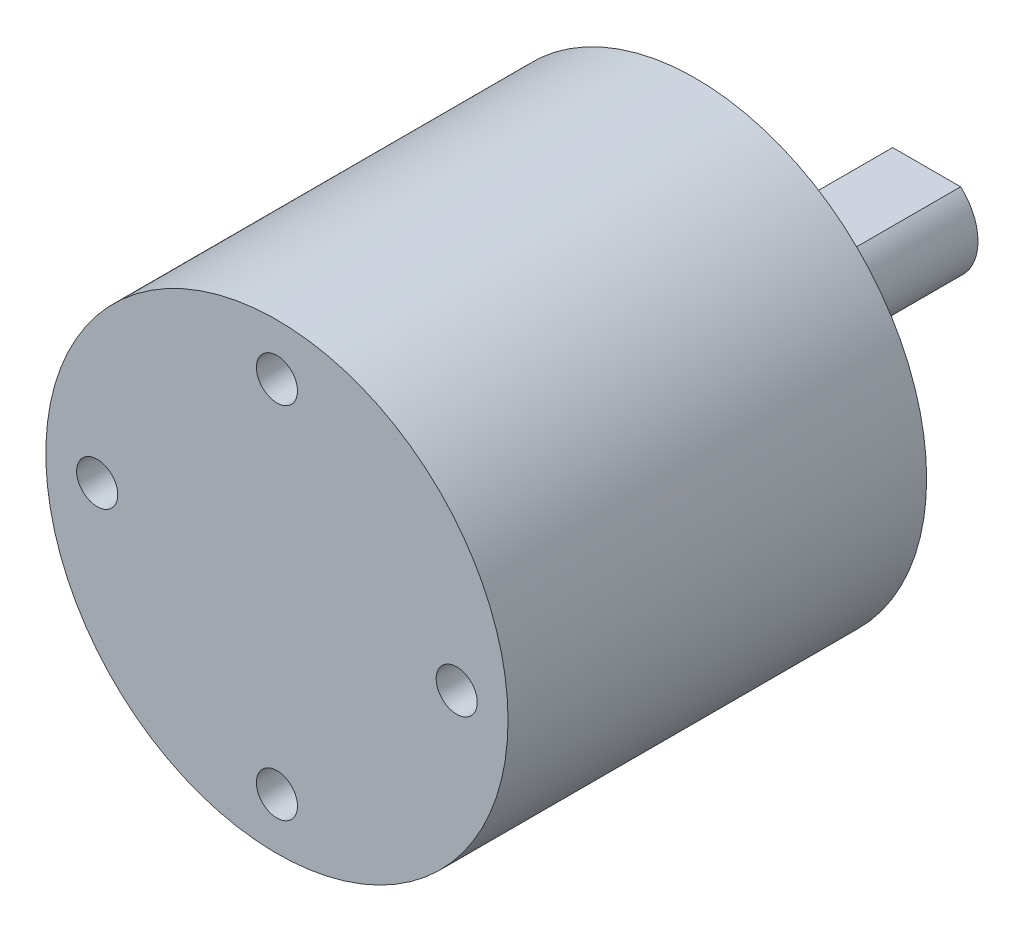
ISO-10303-21;
HEADER;
FILE_DESCRIPTION(('STEP AP214'),'2;1');
FILE_NAME('part.step','',(''),(''),'','','');
FILE_SCHEMA(('AUTOMOTIVE_DESIGN { 1 0 10303 214 1 1 1 1 }'));
ENDSEC;
DATA;
#1=APPLICATION_CONTEXT('core data for automotive mechanical design processes');
#2=APPLICATION_PROTOCOL_DEFINITION('international standard','automotive_design',2000,#1);
#3=PRODUCT_CONTEXT('',#1,'mechanical');
#4=PRODUCT('Part','Part','',(#3));
#5=PRODUCT_RELATED_PRODUCT_CATEGORY('part','',(#4));
#6=PRODUCT_DEFINITION_FORMATION('','',#4);
#7=PRODUCT_DEFINITION_CONTEXT('part definition',#1,'design');
#8=PRODUCT_DEFINITION('design','',#6,#7);
#9=PRODUCT_DEFINITION_SHAPE('','',#8);
#10=(LENGTH_UNIT() NAMED_UNIT(*) SI_UNIT(.MILLI.,.METRE.));
#11=(NAMED_UNIT(*) PLANE_ANGLE_UNIT() SI_UNIT($,.RADIAN.));
#12=(NAMED_UNIT(*) SI_UNIT($,.STERADIAN.) SOLID_ANGLE_UNIT());
#13=UNCERTAINTY_MEASURE_WITH_UNIT(LENGTH_MEASURE(1.E-05),#10,'distance_accuracy_value','');
#14=(GEOMETRIC_REPRESENTATION_CONTEXT(3) GLOBAL_UNCERTAINTY_ASSIGNED_CONTEXT((#13)) GLOBAL_UNIT_ASSIGNED_CONTEXT((#10,
#11,#12)) REPRESENTATION_CONTEXT('',''));
#15=CARTESIAN_POINT('',(0.,0.,0.));
#16=DIRECTION('',(0.,0.,1.));
#17=DIRECTION('',(1.,0.,0.));
#18=AXIS2_PLACEMENT_3D('',#15,#16,#17);
#19=CARTESIAN_POINT('',(0.,0.,32.6));
#20=DIRECTION('',(0.,0.,-1.));
#21=DIRECTION('',(-1.,0.,0.));
#22=AXIS2_PLACEMENT_3D('',#19,#20,#21);
#23=CYLINDRICAL_SURFACE('',#22,18.);
#24=CARTESIAN_POINT('',(0.,0.,32.6));
#25=DIRECTION('',(0.,0.,1.));
#26=DIRECTION('',(1.,0.,0.));
#27=AXIS2_PLACEMENT_3D('',#24,#25,#26);
#28=CIRCLE('',#27,18.);
#29=CARTESIAN_POINT('',(18.,0.,32.6));
#30=VERTEX_POINT('',#29);
#31=EDGE_CURVE('E168',#30,#30,#28,.T.);
#32=ORIENTED_EDGE('',*,*,#31,.F.);
#33=EDGE_LOOP('',(#32));
#34=FACE_BOUND('',#33,.T.);
#35=CARTESIAN_POINT('',(0.,0.,0.));
#36=DIRECTION('',(0.,0.,1.));
#37=DIRECTION('',(1.,0.,0.));
#38=AXIS2_PLACEMENT_3D('',#35,#36,#37);
#39=CIRCLE('',#38,18.);
#40=CARTESIAN_POINT('',(18.,0.,0.));
#41=VERTEX_POINT('',#40);
#42=EDGE_CURVE('E164',#41,#41,#39,.T.);
#43=ORIENTED_EDGE('',*,*,#42,.T.);
#44=EDGE_LOOP('',(#43));
#45=FACE_BOUND('',#44,.T.);
#46=ADVANCED_FACE('F45',(#34,#45),#23,.T.);
#47=CARTESIAN_POINT('',(0.,0.,32.6));
#48=DIRECTION('',(0.,0.,1.));
#49=DIRECTION('',(1.,0.,0.));
#50=AXIS2_PLACEMENT_3D('',#47,#48,#49);
#51=PLANE('',#50);
#52=CARTESIAN_POINT('',(-14.,0.,32.6));
#53=DIRECTION('',(0.,0.,-1.));
#54=DIRECTION('',(0.,-1.,0.));
#55=AXIS2_PLACEMENT_3D('',#52,#53,#54);
#56=CIRCLE('',#55,1.6);
#57=CARTESIAN_POINT('',(-14.,-1.60000000000005,32.6));
#58=VERTEX_POINT('',#57);
#59=EDGE_CURVE('E136',#58,#58,#56,.T.);
#60=ORIENTED_EDGE('',*,*,#59,.T.);
#61=EDGE_LOOP('',(#60));
#62=FACE_BOUND('',#61,.T.);
#63=CARTESIAN_POINT('',(0.,-14.,32.6));
#64=DIRECTION('',(0.,0.,-1.));
#65=DIRECTION('',(1.,0.,0.));
#66=AXIS2_PLACEMENT_3D('',#63,#64,#65);
#67=CIRCLE('',#66,1.6);
#68=CARTESIAN_POINT('',(1.6,-14.,32.6));
#69=VERTEX_POINT('',#68);
#70=EDGE_CURVE('E145',#69,#69,#67,.T.);
#71=ORIENTED_EDGE('',*,*,#70,.T.);
#72=EDGE_LOOP('',(#71));
#73=FACE_BOUND('',#72,.T.);
#74=CARTESIAN_POINT('',(14.,1.46642216231412E-13,32.6));
#75=DIRECTION('',(0.,0.,-1.));
#76=DIRECTION('',(0.,1.,0.));
#77=AXIS2_PLACEMENT_3D('',#74,#75,#76);
#78=CIRCLE('',#77,1.6);
#79=CARTESIAN_POINT('',(14.,1.60000000000015,32.6));
#80=VERTEX_POINT('',#79);
#81=EDGE_CURVE('E153',#80,#80,#78,.T.);
#82=ORIENTED_EDGE('',*,*,#81,.T.);
#83=EDGE_LOOP('',(#82));
#84=FACE_BOUND('',#83,.T.);
#85=CARTESIAN_POINT('',(0.,14.,32.6));
#86=DIRECTION('',(0.,0.,-1.));
#87=DIRECTION('',(-1.,0.,0.));
#88=AXIS2_PLACEMENT_3D('',#85,#86,#87);
#89=CIRCLE('',#88,1.6);
#90=CARTESIAN_POINT('',(-1.6,14.,32.6));
#91=VERTEX_POINT('',#90);
#92=EDGE_CURVE('E160',#91,#91,#89,.T.);
#93=ORIENTED_EDGE('',*,*,#92,.T.);
#94=EDGE_LOOP('',(#93));
#95=FACE_BOUND('',#94,.T.);
#96=ORIENTED_EDGE('',*,*,#31,.T.);
#97=EDGE_LOOP('',(#96));
#98=FACE_BOUND('',#97,.T.);
#99=ADVANCED_FACE('F179',(#62,#73,#84,#95,#98),#51,.T.);
#100=CARTESIAN_POINT('',(0.,0.,0.));
#101=DIRECTION('',(0.,0.,1.));
#102=DIRECTION('',(1.,0.,0.));
#103=AXIS2_PLACEMENT_3D('',#100,#101,#102);
#104=PLANE('',#103);
#105=CARTESIAN_POINT('',(0.,0.,0.));
#106=DIRECTION('',(0.,0.,1.));
#107=DIRECTION('',(1.,0.,0.));
#108=AXIS2_PLACEMENT_3D('',#105,#106,#107);
#109=CIRCLE('',#108,11.);
#110=CARTESIAN_POINT('',(11.,0.,0.));
#111=VERTEX_POINT('',#110);
#112=EDGE_CURVE('E48',#111,#111,#109,.F.);
#113=ORIENTED_EDGE('',*,*,#112,.F.);
#114=EDGE_LOOP('',(#113));
#115=FACE_BOUND('',#114,.T.);
#116=CARTESIAN_POINT('',(-14.,0.,0.));
#117=DIRECTION('',(0.,0.,-1.));
#118=DIRECTION('',(0.,-1.,0.));
#119=AXIS2_PLACEMENT_3D('',#116,#117,#118);
#120=CIRCLE('',#119,1.6);
#121=CARTESIAN_POINT('',(-14.,-1.60000000000005,0.));
#122=VERTEX_POINT('',#121);
#123=EDGE_CURVE('E141',#122,#122,#120,.T.);
#124=ORIENTED_EDGE('',*,*,#123,.F.);
#125=EDGE_LOOP('',(#124));
#126=FACE_BOUND('',#125,.T.);
#127=CARTESIAN_POINT('',(0.,-14.,0.));
#128=DIRECTION('',(0.,0.,-1.));
#129=DIRECTION('',(1.,0.,0.));
#130=AXIS2_PLACEMENT_3D('',#127,#128,#129);
#131=CIRCLE('',#130,1.6);
#132=CARTESIAN_POINT('',(1.6,-14.,0.));
#133=VERTEX_POINT('',#132);
#134=EDGE_CURVE('E149',#133,#133,#131,.T.);
#135=ORIENTED_EDGE('',*,*,#134,.F.);
#136=EDGE_LOOP('',(#135));
#137=FACE_BOUND('',#136,.T.);
#138=CARTESIAN_POINT('',(14.,1.46642216231412E-13,0.));
#139=DIRECTION('',(0.,0.,-1.));
#140=DIRECTION('',(0.,1.,0.));
#141=AXIS2_PLACEMENT_3D('',#138,#139,#140);
#142=CIRCLE('',#141,1.6);
#143=CARTESIAN_POINT('',(14.,1.60000000000015,0.));
#144=VERTEX_POINT('',#143);
#145=EDGE_CURVE('E135',#144,#144,#142,.T.);
#146=ORIENTED_EDGE('',*,*,#145,.F.);
#147=EDGE_LOOP('',(#146));
#148=FACE_BOUND('',#147,.T.);
#149=CARTESIAN_POINT('',(0.,14.,0.));
#150=DIRECTION('',(0.,0.,-1.));
#151=DIRECTION('',(-1.,0.,0.));
#152=AXIS2_PLACEMENT_3D('',#149,#150,#151);
#153=CIRCLE('',#152,1.6);
#154=CARTESIAN_POINT('',(-1.6,14.,0.));
#155=VERTEX_POINT('',#154);
#156=EDGE_CURVE('E140',#155,#155,#153,.T.);
#157=ORIENTED_EDGE('',*,*,#156,.F.);
#158=EDGE_LOOP('',(#157));
#159=FACE_BOUND('',#158,.T.);
#160=ORIENTED_EDGE('',*,*,#42,.F.);
#161=EDGE_LOOP('',(#160));
#162=FACE_BOUND('',#161,.T.);
#163=ADVANCED_FACE('F176',(#115,#126,#137,#148,#159,#162),#104,.F.);
#164=CARTESIAN_POINT('',(0.,14.,32.6));
#165=DIRECTION('',(0.,0.,-1.));
#166=DIRECTION('',(-1.,0.,0.));
#167=AXIS2_PLACEMENT_3D('',#164,#165,#166);
#168=CYLINDRICAL_SURFACE('',#167,1.6);
#169=ORIENTED_EDGE('',*,*,#92,.F.);
#170=EDGE_LOOP('',(#169));
#171=FACE_BOUND('',#170,.T.);
#172=ORIENTED_EDGE('',*,*,#156,.T.);
#173=EDGE_LOOP('',(#172));
#174=FACE_BOUND('',#173,.T.);
#175=ADVANCED_FACE('F178',(#171,#174),#168,.F.);
#176=CARTESIAN_POINT('',(14.,1.46642216231412E-13,32.6));
#177=DIRECTION('',(0.,0.,-1.));
#178=DIRECTION('',(-1.,0.,0.));
#179=AXIS2_PLACEMENT_3D('',#176,#177,#178);
#180=CYLINDRICAL_SURFACE('',#179,1.6);
#181=ORIENTED_EDGE('',*,*,#81,.F.);
#182=EDGE_LOOP('',(#181));
#183=FACE_BOUND('',#182,.T.);
#184=ORIENTED_EDGE('',*,*,#145,.T.);
#185=EDGE_LOOP('',(#184));
#186=FACE_BOUND('',#185,.T.);
#187=ADVANCED_FACE('F186',(#183,#186),#180,.F.);
#188=CARTESIAN_POINT('',(0.,-14.,32.6));
#189=DIRECTION('',(0.,0.,-1.));
#190=DIRECTION('',(-1.,0.,0.));
#191=AXIS2_PLACEMENT_3D('',#188,#189,#190);
#192=CYLINDRICAL_SURFACE('',#191,1.6);
#193=ORIENTED_EDGE('',*,*,#70,.F.);
#194=EDGE_LOOP('',(#193));
#195=FACE_BOUND('',#194,.T.);
#196=ORIENTED_EDGE('',*,*,#134,.T.);
#197=EDGE_LOOP('',(#196));
#198=FACE_BOUND('',#197,.T.);
#199=ADVANCED_FACE('F217',(#195,#198),#192,.F.);
#200=CARTESIAN_POINT('',(-14.,0.,32.6));
#201=DIRECTION('',(0.,0.,-1.));
#202=DIRECTION('',(-1.,0.,0.));
#203=AXIS2_PLACEMENT_3D('',#200,#201,#202);
#204=CYLINDRICAL_SURFACE('',#203,1.6);
#205=ORIENTED_EDGE('',*,*,#59,.F.);
#206=EDGE_LOOP('',(#205));
#207=FACE_BOUND('',#206,.T.);
#208=ORIENTED_EDGE('',*,*,#123,.T.);
#209=EDGE_LOOP('',(#208));
#210=FACE_BOUND('',#209,.T.);
#211=ADVANCED_FACE('F225',(#207,#210),#204,.F.);
#212=CARTESIAN_POINT('',(0.,0.,-2.));
#213=DIRECTION('',(0.,0.,1.));
#214=DIRECTION('',(1.,0.,0.));
#215=AXIS2_PLACEMENT_3D('',#212,#213,#214);
#216=CYLINDRICAL_SURFACE('',#215,11.);
#217=CARTESIAN_POINT('',(0.,0.,-2.));
#218=DIRECTION('',(0.,0.,-1.));
#219=DIRECTION('',(-1.,0.,0.));
#220=AXIS2_PLACEMENT_3D('',#217,#218,#219);
#221=CIRCLE('',#220,11.);
#222=CARTESIAN_POINT('',(-11.,0.,-2.));
#223=VERTEX_POINT('',#222);
#224=EDGE_CURVE('E131',#223,#223,#221,.T.);
#225=ORIENTED_EDGE('',*,*,#224,.F.);
#226=EDGE_LOOP('',(#225));
#227=FACE_BOUND('',#226,.T.);
#228=ORIENTED_EDGE('',*,*,#112,.T.);
#229=EDGE_LOOP('',(#228));
#230=FACE_BOUND('',#229,.T.);
#231=ADVANCED_FACE('F233',(#227,#230),#216,.T.);
#232=CARTESIAN_POINT('',(0.,0.,-2.));
#233=DIRECTION('',(0.,0.,-1.));
#234=DIRECTION('',(-1.,0.,0.));
#235=AXIS2_PLACEMENT_3D('',#232,#233,#234);
#236=PLANE('',#235);
#237=CARTESIAN_POINT('',(0.,0.,-2.));
#238=DIRECTION('',(0.,0.,-1.));
#239=DIRECTION('',(-1.,0.,0.));
#240=AXIS2_PLACEMENT_3D('',#237,#238,#239);
#241=CIRCLE('',#240,4.);
#242=CARTESIAN_POINT('',(-4.,0.,-2.));
#243=VERTEX_POINT('',#242);
#244=EDGE_CURVE('E11',#243,#243,#241,.T.);
#245=ORIENTED_EDGE('',*,*,#244,.F.);
#246=EDGE_LOOP('',(#245));
#247=FACE_BOUND('',#246,.T.);
#248=ORIENTED_EDGE('',*,*,#224,.T.);
#249=EDGE_LOOP('',(#248));
#250=FACE_BOUND('',#249,.T.);
#251=ADVANCED_FACE('F245',(#247,#250),#236,.T.);
#252=CARTESIAN_POINT('',(0.,0.,-18.));
#253=DIRECTION('',(0.,0.,1.));
#254=DIRECTION('',(1.,0.,0.));
#255=AXIS2_PLACEMENT_3D('',#252,#253,#254);
#256=CYLINDRICAL_SURFACE('',#255,4.);
#257=CARTESIAN_POINT('',(0.,0.,-18.));
#258=DIRECTION('',(0.,0.,-1.));
#259=DIRECTION('',(-1.,0.,0.));
#260=AXIS2_PLACEMENT_3D('',#257,#258,#259);
#261=CIRCLE('',#260,4.);
#262=CARTESIAN_POINT('',(-2.64575131106458,-3.00000000000001,-18.));
#263=VERTEX_POINT('',#262);
#264=CARTESIAN_POINT('',(-2.6457513110646,2.99999999999999,-18.));
#265=VERTEX_POINT('',#264);
#266=EDGE_CURVE('E106',#263,#265,#261,.T.);
#267=ORIENTED_EDGE('',*,*,#266,.F.);
#268=DIRECTION('',(0.,0.,-1.));
#269=VECTOR('',#268,1.);
#270=CARTESIAN_POINT('',(-2.64575131106458,-3.00000000000001,-3.));
#271=LINE('',#270,#269);
#272=CARTESIAN_POINT('',(-2.64575131106458,-3.00000000000001,-3.));
#273=VERTEX_POINT('',#272);
#274=EDGE_CURVE('E61',#273,#263,#271,.T.);
#275=ORIENTED_EDGE('',*,*,#274,.F.);
#276=CARTESIAN_POINT('',(0.,0.,-3.));
#277=DIRECTION('',(0.,0.,-1.));
#278=DIRECTION('',(-1.,0.,0.));
#279=AXIS2_PLACEMENT_3D('',#276,#277,#278);
#280=CIRCLE('',#279,4.);
#281=CARTESIAN_POINT('',(2.64575131106458,-3.00000000000001,-3.));
#282=VERTEX_POINT('',#281);
#283=EDGE_CURVE('E89',#282,#273,#280,.T.);
#284=ORIENTED_EDGE('',*,*,#283,.F.);
#285=DIRECTION('',(0.,0.,-1.));
#286=VECTOR('',#285,1.);
#287=CARTESIAN_POINT('',(2.64575131106458,-3.00000000000001,-3.));
#288=LINE('',#287,#286);
#289=CARTESIAN_POINT('',(2.64575131106458,-3.00000000000001,-18.));
#290=VERTEX_POINT('',#289);
#291=EDGE_CURVE('E98',#282,#290,#288,.T.);
#292=ORIENTED_EDGE('',*,*,#291,.T.);
#293=CARTESIAN_POINT('',(2.6457513110646,2.99999999999999,-18.));
#294=VERTEX_POINT('',#293);
#295=EDGE_CURVE('E129',#294,#290,#261,.T.);
#296=ORIENTED_EDGE('',*,*,#295,.F.);
#297=DIRECTION('',(0.,0.,-1.));
#298=VECTOR('',#297,1.);
#299=CARTESIAN_POINT('',(2.6457513110646,2.99999999999999,-3.));
#300=LINE('',#299,#298);
#301=CARTESIAN_POINT('',(2.6457513110646,2.99999999999999,-3.));
#302=VERTEX_POINT('',#301);
#303=EDGE_CURVE('E69',#302,#294,#300,.T.);
#304=ORIENTED_EDGE('',*,*,#303,.F.);
#305=CARTESIAN_POINT('',(0.,0.,-3.));
#306=DIRECTION('',(0.,0.,-1.));
#307=DIRECTION('',(-1.,0.,0.));
#308=AXIS2_PLACEMENT_3D('',#305,#306,#307);
#309=CIRCLE('',#308,4.);
#310=CARTESIAN_POINT('',(-2.6457513110646,2.99999999999999,-3.));
#311=VERTEX_POINT('',#310);
#312=EDGE_CURVE('E122',#311,#302,#309,.T.);
#313=ORIENTED_EDGE('',*,*,#312,.F.);
#314=DIRECTION('',(0.,0.,-1.));
#315=VECTOR('',#314,1.);
#316=CARTESIAN_POINT('',(-2.6457513110646,2.99999999999999,-3.));
#317=LINE('',#316,#315);
#318=EDGE_CURVE('E116',#311,#265,#317,.T.);
#319=ORIENTED_EDGE('',*,*,#318,.T.);
#320=EDGE_LOOP('',(#267,#275,#284,#292,#296,#304,#313,#319));
#321=FACE_BOUND('',#320,.T.);
#322=ORIENTED_EDGE('',*,*,#244,.T.);
#323=EDGE_LOOP('',(#322));
#324=FACE_BOUND('',#323,.T.);
#325=ADVANCED_FACE('F102',(#321,#324),#256,.T.);
#326=CARTESIAN_POINT('',(0.,0.,-18.));
#327=DIRECTION('',(0.,0.,-1.));
#328=DIRECTION('',(-1.,0.,0.));
#329=AXIS2_PLACEMENT_3D('',#326,#327,#328);
#330=PLANE('',#329);
#331=DIRECTION('',(1.,0.,0.));
#332=VECTOR('',#331,1.);
#333=CARTESIAN_POINT('',(2.64575131106458,-3.00000000000001,-18.));
#334=LINE('',#333,#332);
#335=EDGE_CURVE('E95',#263,#290,#334,.T.);
#336=ORIENTED_EDGE('',*,*,#335,.F.);
#337=ORIENTED_EDGE('',*,*,#266,.T.);
#338=DIRECTION('',(-1.,0.,0.));
#339=VECTOR('',#338,1.);
#340=CARTESIAN_POINT('',(2.6457513110646,2.99999999999999,-18.));
#341=LINE('',#340,#339);
#342=EDGE_CURVE('E119',#294,#265,#341,.T.);
#343=ORIENTED_EDGE('',*,*,#342,.F.);
#344=ORIENTED_EDGE('',*,*,#295,.T.);
#345=EDGE_LOOP('',(#336,#337,#343,#344));
#346=FACE_BOUND('',#345,.T.);
#347=ADVANCED_FACE('F264',(#346),#330,.T.);
#348=CARTESIAN_POINT('',(2.6457513110646,2.99999999999999,-3.));
#349=DIRECTION('',(0.,-1.,0.));
#350=DIRECTION('',(0.,0.,-1.));
#351=AXIS2_PLACEMENT_3D('',#348,#349,#350);
#352=PLANE('',#351);
#353=ORIENTED_EDGE('',*,*,#342,.T.);
#354=ORIENTED_EDGE('',*,*,#318,.F.);
#355=DIRECTION('',(-1.,0.,0.));
#356=VECTOR('',#355,1.);
#357=CARTESIAN_POINT('',(2.6457513110646,2.99999999999999,-3.));
#358=LINE('',#357,#356);
#359=EDGE_CURVE('E115',#302,#311,#358,.T.);
#360=ORIENTED_EDGE('',*,*,#359,.F.);
#361=ORIENTED_EDGE('',*,*,#303,.T.);
#362=EDGE_LOOP('',(#353,#354,#360,#361));
#363=FACE_BOUND('',#362,.T.);
#364=ADVANCED_FACE('F273',(#363),#352,.F.);
#365=CARTESIAN_POINT('',(0.,0.,-3.));
#366=DIRECTION('',(0.,0.,-1.));
#367=DIRECTION('',(-1.,0.,0.));
#368=AXIS2_PLACEMENT_3D('',#365,#366,#367);
#369=PLANE('',#368);
#370=ORIENTED_EDGE('',*,*,#312,.T.);
#371=ORIENTED_EDGE('',*,*,#359,.T.);
#372=EDGE_LOOP('',(#370,#371));
#373=FACE_BOUND('',#372,.T.);
#374=ADVANCED_FACE('F283',(#373),#369,.T.);
#375=CARTESIAN_POINT('',(2.64575131106458,-3.00000000000001,-3.));
#376=DIRECTION('',(0.,1.,0.));
#377=DIRECTION('',(-1.,0.,0.));
#378=AXIS2_PLACEMENT_3D('',#375,#376,#377);
#379=PLANE('',#378);
#380=ORIENTED_EDGE('',*,*,#335,.T.);
#381=ORIENTED_EDGE('',*,*,#291,.F.);
#382=DIRECTION('',(1.,0.,0.));
#383=VECTOR('',#382,1.);
#384=CARTESIAN_POINT('',(2.64575131106458,-3.00000000000001,-3.));
#385=LINE('',#384,#383);
#386=EDGE_CURVE('E91',#273,#282,#385,.T.);
#387=ORIENTED_EDGE('',*,*,#386,.F.);
#388=ORIENTED_EDGE('',*,*,#274,.T.);
#389=EDGE_LOOP('',(#380,#381,#387,#388));
#390=FACE_BOUND('',#389,.T.);
#391=ADVANCED_FACE('F97',(#390),#379,.F.);
#392=CARTESIAN_POINT('',(0.,0.,-3.));
#393=DIRECTION('',(0.,0.,-1.));
#394=DIRECTION('',(-1.,0.,0.));
#395=AXIS2_PLACEMENT_3D('',#392,#393,#394);
#396=PLANE('',#395);
#397=ORIENTED_EDGE('',*,*,#283,.T.);
#398=ORIENTED_EDGE('',*,*,#386,.T.);
#399=EDGE_LOOP('',(#397,#398));
#400=FACE_BOUND('',#399,.T.);
#401=ADVANCED_FACE('F90',(#400),#396,.T.);
#402=CLOSED_SHELL('',(#46,#99,#163,#175,#187,#199,#211,#231,#251,#325,#347,#364,#374,#391,#401));
#403=MANIFOLD_SOLID_BREP('B2',#402);
#404=ADVANCED_BREP_SHAPE_REPRESENTATION('',(#18,#403),#14);
#405=SHAPE_DEFINITION_REPRESENTATION(#9,#404);
ENDSEC;
END-ISO-10303-21;
